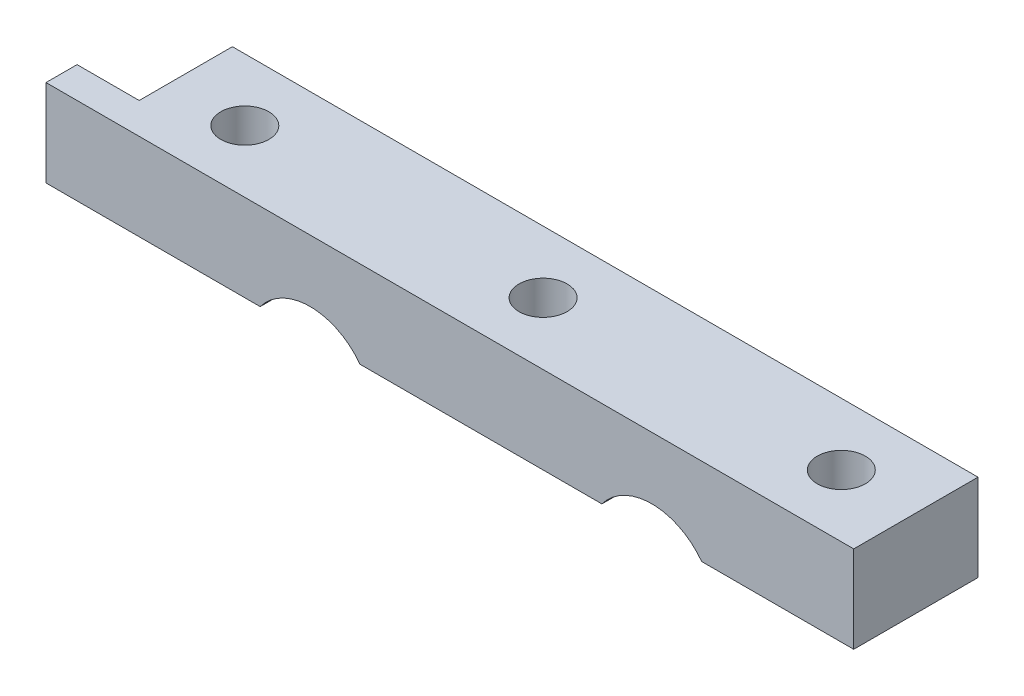
ISO-10303-21;
HEADER;
FILE_DESCRIPTION(('STEP AP214'),'2;1');
FILE_NAME('part.step','',(''),(''),'','','');
FILE_SCHEMA(('AUTOMOTIVE_DESIGN { 1 0 10303 214 1 1 1 1 }'));
ENDSEC;
DATA;
#1=APPLICATION_CONTEXT('core data for automotive mechanical design processes');
#2=APPLICATION_PROTOCOL_DEFINITION('international standard','automotive_design',2000,#1);
#3=PRODUCT_CONTEXT('',#1,'mechanical');
#4=PRODUCT('Part','Part','',(#3));
#5=PRODUCT_RELATED_PRODUCT_CATEGORY('part','',(#4));
#6=PRODUCT_DEFINITION_FORMATION('','',#4);
#7=PRODUCT_DEFINITION_CONTEXT('part definition',#1,'design');
#8=PRODUCT_DEFINITION('design','',#6,#7);
#9=PRODUCT_DEFINITION_SHAPE('','',#8);
#10=(LENGTH_UNIT() NAMED_UNIT(*) SI_UNIT(.MILLI.,.METRE.));
#11=(NAMED_UNIT(*) PLANE_ANGLE_UNIT() SI_UNIT($,.RADIAN.));
#12=(NAMED_UNIT(*) SI_UNIT($,.STERADIAN.) SOLID_ANGLE_UNIT());
#13=UNCERTAINTY_MEASURE_WITH_UNIT(LENGTH_MEASURE(1.E-05),#10,'distance_accuracy_value','');
#14=(GEOMETRIC_REPRESENTATION_CONTEXT(3) GLOBAL_UNCERTAINTY_ASSIGNED_CONTEXT((#13)) GLOBAL_UNIT_ASSIGNED_CONTEXT((#10,
#11,#12)) REPRESENTATION_CONTEXT('',''));
#15=CARTESIAN_POINT('',(0.,0.,0.));
#16=DIRECTION('',(0.,0.,1.));
#17=DIRECTION('',(1.,0.,0.));
#18=AXIS2_PLACEMENT_3D('',#15,#16,#17);
#19=CARTESIAN_POINT('',(-38.1,33.6042,12.7));
#20=DIRECTION('',(0.,-1.,0.));
#21=DIRECTION('',(0.,0.,-1.));
#22=AXIS2_PLACEMENT_3D('',#19,#20,#21);
#23=PLANE('',#22);
#24=CARTESIAN_POINT('',(-30.48,33.6042,6.35000000000001));
#25=DIRECTION('',(0.,1.,0.));
#26=DIRECTION('',(0.,0.,1.));
#27=AXIS2_PLACEMENT_3D('',#24,#25,#26);
#28=CIRCLE('',#27,2.45745);
#29=CARTESIAN_POINT('',(-30.48,33.6042,8.80745));
#30=VERTEX_POINT('',#29);
#31=EDGE_CURVE('E319',#30,#30,#28,.T.);
#32=ORIENTED_EDGE('',*,*,#31,.F.);
#33=EDGE_LOOP('',(#32));
#34=FACE_BOUND('',#33,.T.);
#35=CARTESIAN_POINT('',(0.,33.6042,6.35));
#36=DIRECTION('',(0.,1.,0.));
#37=DIRECTION('',(0.,0.,1.));
#38=AXIS2_PLACEMENT_3D('',#35,#36,#37);
#39=CIRCLE('',#38,2.45745);
#40=CARTESIAN_POINT('',(0.,33.6042,8.80745));
#41=VERTEX_POINT('',#40);
#42=EDGE_CURVE('E318',#41,#41,#39,.T.);
#43=ORIENTED_EDGE('',*,*,#42,.F.);
#44=EDGE_LOOP('',(#43));
#45=FACE_BOUND('',#44,.T.);
#46=DIRECTION('',(-1.,0.,0.));
#47=VECTOR('',#46,1.);
#48=CARTESIAN_POINT('',(-38.1,33.6042,0.));
#49=LINE('',#48,#47);
#50=CARTESIAN_POINT('',(38.1,33.6042,0.));
#51=VERTEX_POINT('',#50);
#52=CARTESIAN_POINT('',(-38.1,33.6042,0.));
#53=VERTEX_POINT('',#52);
#54=EDGE_CURVE('E174',#51,#53,#49,.T.);
#55=ORIENTED_EDGE('',*,*,#54,.T.);
#56=DIRECTION('',(0.,0.,-1.));
#57=VECTOR('',#56,1.);
#58=CARTESIAN_POINT('',(-38.1,33.6042,12.7));
#59=LINE('',#58,#57);
#60=CARTESIAN_POINT('',(-38.1,33.6042,9.525));
#61=VERTEX_POINT('',#60);
#62=EDGE_CURVE('E190',#61,#53,#59,.T.);
#63=ORIENTED_EDGE('',*,*,#62,.F.);
#64=DIRECTION('',(1.,0.,0.));
#65=VECTOR('',#64,1.);
#66=CARTESIAN_POINT('',(-44.45,33.6042,9.525));
#67=LINE('',#66,#65);
#68=CARTESIAN_POINT('',(-44.45,33.6042,9.525));
#69=VERTEX_POINT('',#68);
#70=EDGE_CURVE('E163',#69,#61,#67,.T.);
#71=ORIENTED_EDGE('',*,*,#70,.F.);
#72=DIRECTION('',(0.,0.,-1.));
#73=VECTOR('',#72,1.);
#74=CARTESIAN_POINT('',(-44.45,33.6042,12.7));
#75=LINE('',#74,#73);
#76=CARTESIAN_POINT('',(-44.45,33.6042,12.7));
#77=VERTEX_POINT('',#76);
#78=EDGE_CURVE('E212',#77,#69,#75,.T.);
#79=ORIENTED_EDGE('',*,*,#78,.F.);
#80=DIRECTION('',(-1.,0.,0.));
#81=VECTOR('',#80,1.);
#82=CARTESIAN_POINT('',(-38.1,33.6042,12.7));
#83=LINE('',#82,#81);
#84=CARTESIAN_POINT('',(38.1,33.6042,12.7));
#85=VERTEX_POINT('',#84);
#86=EDGE_CURVE('E149',#85,#77,#83,.T.);
#87=ORIENTED_EDGE('',*,*,#86,.F.);
#88=DIRECTION('',(0.,0.,-1.));
#89=VECTOR('',#88,1.);
#90=CARTESIAN_POINT('',(38.1,33.6042,12.7));
#91=LINE('',#90,#89);
#92=EDGE_CURVE('E143',#85,#51,#91,.T.);
#93=ORIENTED_EDGE('',*,*,#92,.T.);
#94=EDGE_LOOP('',(#55,#63,#71,#79,#87,#93));
#95=FACE_BOUND('',#94,.T.);
#96=CARTESIAN_POINT('',(30.48,33.6042,6.35));
#97=DIRECTION('',(0.,1.,0.));
#98=DIRECTION('',(0.,0.,1.));
#99=AXIS2_PLACEMENT_3D('',#96,#97,#98);
#100=CIRCLE('',#99,2.45745);
#101=CARTESIAN_POINT('',(30.48,33.6042,8.80745));
#102=VERTEX_POINT('',#101);
#103=EDGE_CURVE('E286',#102,#102,#100,.T.);
#104=ORIENTED_EDGE('',*,*,#103,.F.);
#105=EDGE_LOOP('',(#104));
#106=FACE_BOUND('',#105,.T.);
#107=ADVANCED_FACE('F45',(#34,#45,#95,#106),#23,.F.);
#108=CARTESIAN_POINT('',(-38.1,24.7142,12.7));
#109=DIRECTION('',(1.,0.,0.));
#110=DIRECTION('',(0.,0.,-1.));
#111=AXIS2_PLACEMENT_3D('',#108,#109,#110);
#112=PLANE('',#111);
#113=DIRECTION('',(0.,-1.,0.));
#114=VECTOR('',#113,1.);
#115=CARTESIAN_POINT('',(-38.1,33.6042,9.525));
#116=LINE('',#115,#114);
#117=CARTESIAN_POINT('',(-38.1,24.7142,9.525));
#118=VERTEX_POINT('',#117);
#119=EDGE_CURVE('E61',#61,#118,#116,.T.);
#120=ORIENTED_EDGE('',*,*,#119,.F.);
#121=ORIENTED_EDGE('',*,*,#62,.T.);
#122=DIRECTION('',(0.,-1.,0.));
#123=VECTOR('',#122,1.);
#124=CARTESIAN_POINT('',(-38.1,24.7142,0.));
#125=LINE('',#124,#123);
#126=CARTESIAN_POINT('',(-38.1,24.7142,0.));
#127=VERTEX_POINT('',#126);
#128=EDGE_CURVE('E178',#53,#127,#125,.T.);
#129=ORIENTED_EDGE('',*,*,#128,.T.);
#130=DIRECTION('',(0.,0.,-1.));
#131=VECTOR('',#130,1.);
#132=CARTESIAN_POINT('',(-38.1,24.7142,12.7));
#133=LINE('',#132,#131);
#134=EDGE_CURVE('E187',#118,#127,#133,.T.);
#135=ORIENTED_EDGE('',*,*,#134,.F.);
#136=EDGE_LOOP('',(#120,#121,#129,#135));
#137=FACE_BOUND('',#136,.T.);
#138=ADVANCED_FACE('F263',(#137),#112,.F.);
#139=CARTESIAN_POINT('',(-17.4625,20.9296,12.7));
#140=DIRECTION('',(0.,0.,-1.));
#141=DIRECTION('',(-1.,0.,0.));
#142=AXIS2_PLACEMENT_3D('',#139,#140,#141);
#143=CYLINDRICAL_SURFACE('',#142,6.35);
#144=CARTESIAN_POINT('',(-17.4625,20.9296,0.));
#145=DIRECTION('',(0.,0.,-1.));
#146=DIRECTION('',(1.,0.,0.));
#147=AXIS2_PLACEMENT_3D('',#144,#145,#146);
#148=CIRCLE('',#147,6.35);
#149=CARTESIAN_POINT('',(-22.5614511509721,24.7142,0.));
#150=VERTEX_POINT('',#149);
#151=CARTESIAN_POINT('',(-12.3635488490279,24.7142,0.));
#152=VERTEX_POINT('',#151);
#153=EDGE_CURVE('E158',#150,#152,#148,.T.);
#154=ORIENTED_EDGE('',*,*,#153,.T.);
#155=DIRECTION('',(0.,0.,-1.));
#156=VECTOR('',#155,1.);
#157=CARTESIAN_POINT('',(-12.3635488490279,24.7142,12.7));
#158=LINE('',#157,#156);
#159=CARTESIAN_POINT('',(-12.3635488490279,24.7142,12.7));
#160=VERTEX_POINT('',#159);
#161=EDGE_CURVE('E11',#160,#152,#158,.T.);
#162=ORIENTED_EDGE('',*,*,#161,.F.);
#163=CARTESIAN_POINT('',(-17.4625,20.9296,12.7));
#164=DIRECTION('',(0.,0.,-1.));
#165=DIRECTION('',(1.,0.,0.));
#166=AXIS2_PLACEMENT_3D('',#163,#164,#165);
#167=CIRCLE('',#166,6.35);
#168=CARTESIAN_POINT('',(-22.5614511509721,24.7142,12.7));
#169=VERTEX_POINT('',#168);
#170=EDGE_CURVE('E184',#169,#160,#167,.T.);
#171=ORIENTED_EDGE('',*,*,#170,.F.);
#172=DIRECTION('',(0.,0.,-1.));
#173=VECTOR('',#172,1.);
#174=CARTESIAN_POINT('',(-22.5614511509721,24.7142,12.7));
#175=LINE('',#174,#173);
#176=EDGE_CURVE('E157',#169,#150,#175,.T.);
#177=ORIENTED_EDGE('',*,*,#176,.T.);
#178=EDGE_LOOP('',(#154,#162,#171,#177));
#179=FACE_BOUND('',#178,.T.);
#180=ADVANCED_FACE('F47',(#179),#143,.F.);
#181=CARTESIAN_POINT('',(-12.3635488490279,24.7142,12.7));
#182=DIRECTION('',(0.,1.,0.));
#183=DIRECTION('',(0.,0.,1.));
#184=AXIS2_PLACEMENT_3D('',#181,#182,#183);
#185=PLANE('',#184);
#186=CARTESIAN_POINT('',(0.,24.7142,6.35));
#187=DIRECTION('',(0.,1.,0.));
#188=DIRECTION('',(0.,0.,1.));
#189=AXIS2_PLACEMENT_3D('',#186,#187,#188);
#190=CIRCLE('',#189,2.45745);
#191=CARTESIAN_POINT('',(0.,24.7142,8.80745));
#192=VERTEX_POINT('',#191);
#193=EDGE_CURVE('E290',#192,#192,#190,.T.);
#194=ORIENTED_EDGE('',*,*,#193,.T.);
#195=EDGE_LOOP('',(#194));
#196=FACE_BOUND('',#195,.T.);
#197=DIRECTION('',(1.,0.,0.));
#198=VECTOR('',#197,1.);
#199=CARTESIAN_POINT('',(-12.3635488490279,24.7142,0.));
#200=LINE('',#199,#198);
#201=CARTESIAN_POINT('',(12.3635488490279,24.7142,0.));
#202=VERTEX_POINT('',#201);
#203=EDGE_CURVE('E162',#152,#202,#200,.T.);
#204=ORIENTED_EDGE('',*,*,#203,.T.);
#205=DIRECTION('',(0.,0.,-1.));
#206=VECTOR('',#205,1.);
#207=CARTESIAN_POINT('',(12.3635488490279,24.7142,12.7));
#208=LINE('',#207,#206);
#209=CARTESIAN_POINT('',(12.3635488490279,24.7142,12.7));
#210=VERTEX_POINT('',#209);
#211=EDGE_CURVE('E54',#210,#202,#208,.T.);
#212=ORIENTED_EDGE('',*,*,#211,.F.);
#213=DIRECTION('',(1.,0.,0.));
#214=VECTOR('',#213,1.);
#215=CARTESIAN_POINT('',(-12.3635488490279,24.7142,12.7));
#216=LINE('',#215,#214);
#217=EDGE_CURVE('E110',#160,#210,#216,.T.);
#218=ORIENTED_EDGE('',*,*,#217,.F.);
#219=ORIENTED_EDGE('',*,*,#161,.T.);
#220=EDGE_LOOP('',(#204,#212,#218,#219));
#221=FACE_BOUND('',#220,.T.);
#222=ADVANCED_FACE('F253',(#196,#221),#185,.F.);
#223=CARTESIAN_POINT('',(17.4625,20.9296,12.7));
#224=DIRECTION('',(0.,0.,-1.));
#225=DIRECTION('',(-1.,0.,0.));
#226=AXIS2_PLACEMENT_3D('',#223,#224,#225);
#227=CYLINDRICAL_SURFACE('',#226,6.35);
#228=CARTESIAN_POINT('',(17.4625,20.9296,0.));
#229=DIRECTION('',(0.,0.,-1.));
#230=DIRECTION('',(-1.,0.,0.));
#231=AXIS2_PLACEMENT_3D('',#228,#229,#230);
#232=CIRCLE('',#231,6.35);
#233=CARTESIAN_POINT('',(22.5614511509721,24.7142,0.));
#234=VERTEX_POINT('',#233);
#235=EDGE_CURVE('E166',#202,#234,#232,.T.);
#236=ORIENTED_EDGE('',*,*,#235,.T.);
#237=DIRECTION('',(0.,0.,-1.));
#238=VECTOR('',#237,1.);
#239=CARTESIAN_POINT('',(22.5614511509721,24.7142,12.7));
#240=LINE('',#239,#238);
#241=CARTESIAN_POINT('',(22.5614511509721,24.7142,12.7));
#242=VERTEX_POINT('',#241);
#243=EDGE_CURVE('E142',#242,#234,#240,.T.);
#244=ORIENTED_EDGE('',*,*,#243,.F.);
#245=CARTESIAN_POINT('',(17.4625,20.9296,12.7));
#246=DIRECTION('',(0.,0.,-1.));
#247=DIRECTION('',(-1.,0.,0.));
#248=AXIS2_PLACEMENT_3D('',#245,#246,#247);
#249=CIRCLE('',#248,6.35);
#250=EDGE_CURVE('E128',#210,#242,#249,.T.);
#251=ORIENTED_EDGE('',*,*,#250,.F.);
#252=ORIENTED_EDGE('',*,*,#211,.T.);
#253=EDGE_LOOP('',(#236,#244,#251,#252));
#254=FACE_BOUND('',#253,.T.);
#255=ADVANCED_FACE('F200',(#254),#227,.F.);
#256=CARTESIAN_POINT('',(22.5614511509721,24.7142,12.7));
#257=DIRECTION('',(0.,1.,0.));
#258=DIRECTION('',(0.,0.,1.));
#259=AXIS2_PLACEMENT_3D('',#256,#257,#258);
#260=PLANE('',#259);
#261=CARTESIAN_POINT('',(30.48,24.7142,6.35));
#262=DIRECTION('',(0.,1.,0.));
#263=DIRECTION('',(0.,0.,1.));
#264=AXIS2_PLACEMENT_3D('',#261,#262,#263);
#265=CIRCLE('',#264,2.45745);
#266=CARTESIAN_POINT('',(30.48,24.7142,8.80745));
#267=VERTEX_POINT('',#266);
#268=EDGE_CURVE('E242',#267,#267,#265,.T.);
#269=ORIENTED_EDGE('',*,*,#268,.T.);
#270=EDGE_LOOP('',(#269));
#271=FACE_BOUND('',#270,.T.);
#272=DIRECTION('',(1.,0.,0.));
#273=VECTOR('',#272,1.);
#274=CARTESIAN_POINT('',(22.5614511509721,24.7142,0.));
#275=LINE('',#274,#273);
#276=CARTESIAN_POINT('',(38.1,24.7142,0.));
#277=VERTEX_POINT('',#276);
#278=EDGE_CURVE('E138',#234,#277,#275,.T.);
#279=ORIENTED_EDGE('',*,*,#278,.T.);
#280=DIRECTION('',(0.,0.,-1.));
#281=VECTOR('',#280,1.);
#282=CARTESIAN_POINT('',(38.1,24.7142,12.7));
#283=LINE('',#282,#281);
#284=CARTESIAN_POINT('',(38.1,24.7142,12.7));
#285=VERTEX_POINT('',#284);
#286=EDGE_CURVE('E135',#285,#277,#283,.T.);
#287=ORIENTED_EDGE('',*,*,#286,.F.);
#288=DIRECTION('',(1.,0.,0.));
#289=VECTOR('',#288,1.);
#290=CARTESIAN_POINT('',(22.5614511509721,24.7142,12.7));
#291=LINE('',#290,#289);
#292=EDGE_CURVE('E120',#242,#285,#291,.T.);
#293=ORIENTED_EDGE('',*,*,#292,.F.);
#294=ORIENTED_EDGE('',*,*,#243,.T.);
#295=EDGE_LOOP('',(#279,#287,#293,#294));
#296=FACE_BOUND('',#295,.T.);
#297=ADVANCED_FACE('F136',(#271,#296),#260,.F.);
#298=CARTESIAN_POINT('',(38.1,33.6042,12.7));
#299=DIRECTION('',(-1.,0.,0.));
#300=DIRECTION('',(0.,0.,1.));
#301=AXIS2_PLACEMENT_3D('',#298,#299,#300);
#302=PLANE('',#301);
#303=DIRECTION('',(0.,1.,0.));
#304=VECTOR('',#303,1.);
#305=CARTESIAN_POINT('',(38.1,33.6042,0.));
#306=LINE('',#305,#304);
#307=EDGE_CURVE('E171',#277,#51,#306,.T.);
#308=ORIENTED_EDGE('',*,*,#307,.T.);
#309=ORIENTED_EDGE('',*,*,#92,.F.);
#310=DIRECTION('',(0.,1.,0.));
#311=VECTOR('',#310,1.);
#312=CARTESIAN_POINT('',(38.1,33.6042,12.7));
#313=LINE('',#312,#311);
#314=EDGE_CURVE('E125',#285,#85,#313,.T.);
#315=ORIENTED_EDGE('',*,*,#314,.F.);
#316=ORIENTED_EDGE('',*,*,#286,.T.);
#317=EDGE_LOOP('',(#308,#309,#315,#316));
#318=FACE_BOUND('',#317,.T.);
#319=ADVANCED_FACE('F145',(#318),#302,.F.);
#320=CARTESIAN_POINT('',(-38.1,24.7142,12.7));
#321=DIRECTION('',(0.,1.,0.));
#322=DIRECTION('',(0.,0.,1.));
#323=AXIS2_PLACEMENT_3D('',#320,#321,#322);
#324=PLANE('',#323);
#325=CARTESIAN_POINT('',(-30.48,24.7142,6.35000000000001));
#326=DIRECTION('',(0.,1.,0.));
#327=DIRECTION('',(0.,0.,1.));
#328=AXIS2_PLACEMENT_3D('',#325,#326,#327);
#329=CIRCLE('',#328,2.45745);
#330=CARTESIAN_POINT('',(-30.48,24.7142,8.80745));
#331=VERTEX_POINT('',#330);
#332=EDGE_CURVE('E315',#331,#331,#329,.T.);
#333=ORIENTED_EDGE('',*,*,#332,.T.);
#334=EDGE_LOOP('',(#333));
#335=FACE_BOUND('',#334,.T.);
#336=DIRECTION('',(1.,0.,0.));
#337=VECTOR('',#336,1.);
#338=CARTESIAN_POINT('',(-38.1,24.7142,0.));
#339=LINE('',#338,#337);
#340=EDGE_CURVE('E102',#127,#150,#339,.T.);
#341=ORIENTED_EDGE('',*,*,#340,.T.);
#342=ORIENTED_EDGE('',*,*,#176,.F.);
#343=DIRECTION('',(1.,0.,0.));
#344=VECTOR('',#343,1.);
#345=CARTESIAN_POINT('',(-38.1,24.7142,12.7));
#346=LINE('',#345,#344);
#347=CARTESIAN_POINT('',(-44.45,24.7142,12.7));
#348=VERTEX_POINT('',#347);
#349=EDGE_CURVE('E70',#348,#169,#346,.T.);
#350=ORIENTED_EDGE('',*,*,#349,.F.);
#351=DIRECTION('',(0.,0.,1.));
#352=VECTOR('',#351,1.);
#353=CARTESIAN_POINT('',(-44.45,24.7142,12.7));
#354=LINE('',#353,#352);
#355=CARTESIAN_POINT('',(-44.45,24.7142,9.525));
#356=VERTEX_POINT('',#355);
#357=EDGE_CURVE('E225',#356,#348,#354,.T.);
#358=ORIENTED_EDGE('',*,*,#357,.F.);
#359=DIRECTION('',(1.,0.,0.));
#360=VECTOR('',#359,1.);
#361=CARTESIAN_POINT('',(-44.45,24.7142,9.525));
#362=LINE('',#361,#360);
#363=EDGE_CURVE('E233',#356,#118,#362,.T.);
#364=ORIENTED_EDGE('',*,*,#363,.T.);
#365=ORIENTED_EDGE('',*,*,#134,.T.);
#366=EDGE_LOOP('',(#341,#342,#350,#358,#364,#365));
#367=FACE_BOUND('',#366,.T.);
#368=ADVANCED_FACE('F223',(#335,#367),#324,.F.);
#369=CARTESIAN_POINT('',(-17.4625,20.9296,12.7));
#370=DIRECTION('',(0.,0.,1.));
#371=DIRECTION('',(1.,0.,0.));
#372=AXIS2_PLACEMENT_3D('',#369,#370,#371);
#373=PLANE('',#372);
#374=ORIENTED_EDGE('',*,*,#170,.T.);
#375=ORIENTED_EDGE('',*,*,#217,.T.);
#376=ORIENTED_EDGE('',*,*,#250,.T.);
#377=ORIENTED_EDGE('',*,*,#292,.T.);
#378=ORIENTED_EDGE('',*,*,#314,.T.);
#379=ORIENTED_EDGE('',*,*,#86,.T.);
#380=DIRECTION('',(0.,1.,0.));
#381=VECTOR('',#380,1.);
#382=CARTESIAN_POINT('',(-44.45,33.6042,12.7));
#383=LINE('',#382,#381);
#384=EDGE_CURVE('E214',#348,#77,#383,.T.);
#385=ORIENTED_EDGE('',*,*,#384,.F.);
#386=ORIENTED_EDGE('',*,*,#349,.T.);
#387=EDGE_LOOP('',(#374,#375,#376,#377,#378,#379,#385,#386));
#388=FACE_BOUND('',#387,.T.);
#389=ADVANCED_FACE('F122',(#388),#373,.T.);
#390=CARTESIAN_POINT('',(-17.4625,20.9296,0.));
#391=DIRECTION('',(0.,0.,1.));
#392=DIRECTION('',(1.,0.,0.));
#393=AXIS2_PLACEMENT_3D('',#390,#391,#392);
#394=PLANE('',#393);
#395=ORIENTED_EDGE('',*,*,#153,.F.);
#396=ORIENTED_EDGE('',*,*,#340,.F.);
#397=ORIENTED_EDGE('',*,*,#128,.F.);
#398=ORIENTED_EDGE('',*,*,#54,.F.);
#399=ORIENTED_EDGE('',*,*,#307,.F.);
#400=ORIENTED_EDGE('',*,*,#278,.F.);
#401=ORIENTED_EDGE('',*,*,#235,.F.);
#402=ORIENTED_EDGE('',*,*,#203,.F.);
#403=EDGE_LOOP('',(#395,#396,#397,#398,#399,#400,#401,#402));
#404=FACE_BOUND('',#403,.T.);
#405=ADVANCED_FACE('F203',(#404),#394,.F.);
#406=CARTESIAN_POINT('',(-44.45,33.6042,9.525));
#407=DIRECTION('',(0.,0.,1.));
#408=DIRECTION('',(0.,-1.,0.));
#409=AXIS2_PLACEMENT_3D('',#406,#407,#408);
#410=PLANE('',#409);
#411=ORIENTED_EDGE('',*,*,#119,.T.);
#412=ORIENTED_EDGE('',*,*,#363,.F.);
#413=DIRECTION('',(0.,-1.,0.));
#414=VECTOR('',#413,1.);
#415=CARTESIAN_POINT('',(-44.45,33.6042,9.525));
#416=LINE('',#415,#414);
#417=EDGE_CURVE('E230',#69,#356,#416,.T.);
#418=ORIENTED_EDGE('',*,*,#417,.F.);
#419=ORIENTED_EDGE('',*,*,#70,.T.);
#420=EDGE_LOOP('',(#411,#412,#418,#419));
#421=FACE_BOUND('',#420,.T.);
#422=ADVANCED_FACE('F297',(#421),#410,.F.);
#423=CARTESIAN_POINT('',(-44.45,0.,0.));
#424=DIRECTION('',(1.,0.,0.));
#425=DIRECTION('',(0.,0.,-1.));
#426=AXIS2_PLACEMENT_3D('',#423,#424,#425);
#427=PLANE('',#426);
#428=ORIENTED_EDGE('',*,*,#384,.T.);
#429=ORIENTED_EDGE('',*,*,#78,.T.);
#430=ORIENTED_EDGE('',*,*,#417,.T.);
#431=ORIENTED_EDGE('',*,*,#357,.T.);
#432=EDGE_LOOP('',(#428,#429,#430,#431));
#433=FACE_BOUND('',#432,.T.);
#434=ADVANCED_FACE('F228',(#433),#427,.F.);
#435=CARTESIAN_POINT('',(30.48,33.6042,6.35));
#436=DIRECTION('',(0.,1.,0.));
#437=DIRECTION('',(0.,0.,1.));
#438=AXIS2_PLACEMENT_3D('',#435,#436,#437);
#439=CYLINDRICAL_SURFACE('',#438,2.45745);
#440=ORIENTED_EDGE('',*,*,#268,.F.);
#441=EDGE_LOOP('',(#440));
#442=FACE_BOUND('',#441,.T.);
#443=ORIENTED_EDGE('',*,*,#103,.T.);
#444=EDGE_LOOP('',(#443));
#445=FACE_BOUND('',#444,.T.);
#446=ADVANCED_FACE('F303',(#442,#445),#439,.F.);
#447=CARTESIAN_POINT('',(0.,33.6042,6.35));
#448=DIRECTION('',(0.,1.,0.));
#449=DIRECTION('',(0.,0.,1.));
#450=AXIS2_PLACEMENT_3D('',#447,#448,#449);
#451=CYLINDRICAL_SURFACE('',#450,2.45745);
#452=ORIENTED_EDGE('',*,*,#193,.F.);
#453=EDGE_LOOP('',(#452));
#454=FACE_BOUND('',#453,.T.);
#455=ORIENTED_EDGE('',*,*,#42,.T.);
#456=EDGE_LOOP('',(#455));
#457=FACE_BOUND('',#456,.T.);
#458=ADVANCED_FACE('F330',(#454,#457),#451,.F.);
#459=CARTESIAN_POINT('',(-30.48,33.6042,6.35000000000001));
#460=DIRECTION('',(0.,1.,0.));
#461=DIRECTION('',(0.,0.,1.));
#462=AXIS2_PLACEMENT_3D('',#459,#460,#461);
#463=CYLINDRICAL_SURFACE('',#462,2.45745);
#464=ORIENTED_EDGE('',*,*,#332,.F.);
#465=EDGE_LOOP('',(#464));
#466=FACE_BOUND('',#465,.T.);
#467=ORIENTED_EDGE('',*,*,#31,.T.);
#468=EDGE_LOOP('',(#467));
#469=FACE_BOUND('',#468,.T.);
#470=ADVANCED_FACE('F333',(#466,#469),#463,.F.);
#471=CLOSED_SHELL('',(#107,#138,#180,#222,#255,#297,#319,#368,#389,#405,#422,#434,#446,#458,#470));
#472=MANIFOLD_SOLID_BREP('B2',#471);
#473=ADVANCED_BREP_SHAPE_REPRESENTATION('',(#18,#472),#14);
#474=SHAPE_DEFINITION_REPRESENTATION(#9,#473);
ENDSEC;
END-ISO-10303-21;
